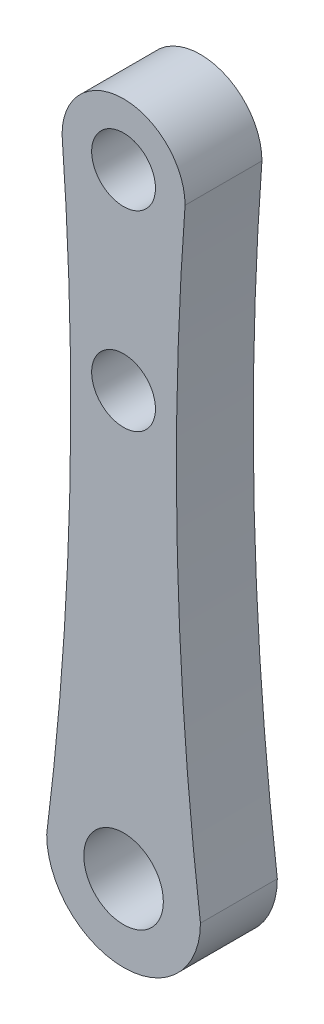
ISO-10303-21;
HEADER;
FILE_DESCRIPTION(('STEP AP214'),'2;1');
FILE_NAME('part.step','',(''),(''),'','','');
FILE_SCHEMA(('AUTOMOTIVE_DESIGN { 1 0 10303 214 1 1 1 1 }'));
ENDSEC;
DATA;
#1=APPLICATION_CONTEXT('core data for automotive mechanical design processes');
#2=APPLICATION_PROTOCOL_DEFINITION('international standard','automotive_design',2000,#1);
#3=PRODUCT_CONTEXT('',#1,'mechanical');
#4=PRODUCT('Part','Part','',(#3));
#5=PRODUCT_RELATED_PRODUCT_CATEGORY('part','',(#4));
#6=PRODUCT_DEFINITION_FORMATION('','',#4);
#7=PRODUCT_DEFINITION_CONTEXT('part definition',#1,'design');
#8=PRODUCT_DEFINITION('design','',#6,#7);
#9=PRODUCT_DEFINITION_SHAPE('','',#8);
#10=(LENGTH_UNIT() NAMED_UNIT(*) SI_UNIT(.MILLI.,.METRE.));
#11=(NAMED_UNIT(*) PLANE_ANGLE_UNIT() SI_UNIT($,.RADIAN.));
#12=(NAMED_UNIT(*) SI_UNIT($,.STERADIAN.) SOLID_ANGLE_UNIT());
#13=UNCERTAINTY_MEASURE_WITH_UNIT(LENGTH_MEASURE(1.E-05),#10,'distance_accuracy_value','');
#14=(GEOMETRIC_REPRESENTATION_CONTEXT(3) GLOBAL_UNCERTAINTY_ASSIGNED_CONTEXT((#13)) GLOBAL_UNIT_ASSIGNED_CONTEXT((#10,
#11,#12)) REPRESENTATION_CONTEXT('',''));
#15=CARTESIAN_POINT('',(0.,0.,0.));
#16=DIRECTION('',(0.,0.,1.));
#17=DIRECTION('',(1.,0.,0.));
#18=AXIS2_PLACEMENT_3D('',#15,#16,#17);
#19=CARTESIAN_POINT('',(5.51154355847069,124.948065501126,5.));
#20=DIRECTION('',(0.,0.,-1.));
#21=DIRECTION('',(-1.,0.,0.));
#22=AXIS2_PLACEMENT_3D('',#19,#20,#21);
#23=PLANE('',#22);
#24=CARTESIAN_POINT('',(-197.858317403009,149.896131002252,5.));
#25=DIRECTION('',(0.,0.,-1.));
#26=DIRECTION('',(-1.,0.,0.));
#27=AXIS2_PLACEMENT_3D('',#24,#25,#26);
#28=CIRCLE('',#27,399.865015774699);
#29=CARTESIAN_POINT('',(200.88140451995,179.873872766802,5.));
#30=VERTEX_POINT('',#29);
#31=CARTESIAN_POINT('',(198.88140451995,100.,5.));
#32=VERTEX_POINT('',#31);
#33=EDGE_CURVE('E84',#30,#32,#28,.T.);
#34=ORIENTED_EDGE('',*,*,#33,.T.);
#35=CARTESIAN_POINT('',(208.88140451995,100.,5.));
#36=DIRECTION('',(0.,0.,1.));
#37=DIRECTION('',(1.,0.,0.));
#38=AXIS2_PLACEMENT_3D('',#35,#36,#37);
#39=CIRCLE('',#38,10.);
#40=CARTESIAN_POINT('',(218.88140451995,100.,5.));
#41=VERTEX_POINT('',#40);
#42=EDGE_CURVE('E79',#32,#41,#39,.T.);
#43=ORIENTED_EDGE('',*,*,#42,.T.);
#44=CARTESIAN_POINT('',(615.621126442908,149.896131002252,5.));
#45=DIRECTION('',(0.,0.,-1.));
#46=DIRECTION('',(1.,0.,0.));
#47=AXIS2_PLACEMENT_3D('',#44,#45,#46);
#48=CIRCLE('',#47,399.865015774698);
#49=CARTESIAN_POINT('',(216.88140451995,179.873872766802,5.));
#50=VERTEX_POINT('',#49);
#51=EDGE_CURVE('E82',#41,#50,#48,.T.);
#52=ORIENTED_EDGE('',*,*,#51,.T.);
#53=CARTESIAN_POINT('',(208.88140451995,179.873872766802,5.));
#54=DIRECTION('',(0.,0.,1.));
#55=DIRECTION('',(1.,0.,0.));
#56=AXIS2_PLACEMENT_3D('',#53,#54,#55);
#57=CIRCLE('',#56,8.00000000000001);
#58=EDGE_CURVE('E49',#50,#30,#57,.T.);
#59=ORIENTED_EDGE('',*,*,#58,.T.);
#60=EDGE_LOOP('',(#34,#43,#52,#59));
#61=FACE_BOUND('',#60,.T.);
#62=CARTESIAN_POINT('',(208.88140451995,155.,5.));
#63=DIRECTION('',(0.,0.,1.));
#64=DIRECTION('',(1.,0.,0.));
#65=AXIS2_PLACEMENT_3D('',#62,#63,#64);
#66=CIRCLE('',#65,4.14999999999998);
#67=CARTESIAN_POINT('',(213.03140451995,155.,5.));
#68=VERTEX_POINT('',#67);
#69=EDGE_CURVE('E99',#68,#68,#66,.T.);
#70=ORIENTED_EDGE('',*,*,#69,.F.);
#71=EDGE_LOOP('',(#70));
#72=FACE_BOUND('',#71,.T.);
#73=CARTESIAN_POINT('',(208.88140451995,179.873872766802,5.));
#74=DIRECTION('',(0.,0.,1.));
#75=DIRECTION('',(1.,0.,0.));
#76=AXIS2_PLACEMENT_3D('',#73,#74,#75);
#77=CIRCLE('',#76,4.14999999999998);
#78=CARTESIAN_POINT('',(213.03140451995,179.873872766802,5.));
#79=VERTEX_POINT('',#78);
#80=EDGE_CURVE('E114',#79,#79,#77,.T.);
#81=ORIENTED_EDGE('',*,*,#80,.F.);
#82=EDGE_LOOP('',(#81));
#83=FACE_BOUND('',#82,.T.);
#84=CARTESIAN_POINT('',(208.88140451995,100.,5.));
#85=DIRECTION('',(0.,0.,1.));
#86=DIRECTION('',(1.,0.,0.));
#87=AXIS2_PLACEMENT_3D('',#84,#85,#86);
#88=CIRCLE('',#87,5.17500000000002);
#89=CARTESIAN_POINT('',(214.05640451995,100.,5.));
#90=VERTEX_POINT('',#89);
#91=EDGE_CURVE('E120',#90,#90,#88,.T.);
#92=ORIENTED_EDGE('',*,*,#91,.F.);
#93=EDGE_LOOP('',(#92));
#94=FACE_BOUND('',#93,.T.);
#95=ADVANCED_FACE('F32',(#61,#72,#83,#94),#23,.F.);
#96=CARTESIAN_POINT('',(5.51154355847069,124.948065501126,-5.));
#97=DIRECTION('',(0.,0.,-1.));
#98=DIRECTION('',(-1.,0.,0.));
#99=AXIS2_PLACEMENT_3D('',#96,#97,#98);
#100=PLANE('',#99);
#101=CARTESIAN_POINT('',(208.88140451995,179.873872766802,-5.));
#102=DIRECTION('',(0.,0.,1.));
#103=DIRECTION('',(1.,0.,0.));
#104=AXIS2_PLACEMENT_3D('',#101,#102,#103);
#105=CIRCLE('',#104,4.14999999999998);
#106=CARTESIAN_POINT('',(213.03140451995,179.873872766802,-5.));
#107=VERTEX_POINT('',#106);
#108=EDGE_CURVE('E117',#107,#107,#105,.T.);
#109=ORIENTED_EDGE('',*,*,#108,.T.);
#110=EDGE_LOOP('',(#109));
#111=FACE_BOUND('',#110,.T.);
#112=CARTESIAN_POINT('',(-197.858317403009,149.896131002252,-5.));
#113=DIRECTION('',(0.,0.,-1.));
#114=DIRECTION('',(-1.,0.,0.));
#115=AXIS2_PLACEMENT_3D('',#112,#113,#114);
#116=CIRCLE('',#115,399.865015774699);
#117=CARTESIAN_POINT('',(200.88140451995,179.873872766802,-5.));
#118=VERTEX_POINT('',#117);
#119=CARTESIAN_POINT('',(198.88140451995,100.,-5.));
#120=VERTEX_POINT('',#119);
#121=EDGE_CURVE('E96',#118,#120,#116,.T.);
#122=ORIENTED_EDGE('',*,*,#121,.F.);
#123=CARTESIAN_POINT('',(208.88140451995,179.873872766802,-5.));
#124=DIRECTION('',(0.,0.,1.));
#125=DIRECTION('',(1.,0.,0.));
#126=AXIS2_PLACEMENT_3D('',#123,#124,#125);
#127=CIRCLE('',#126,8.00000000000001);
#128=CARTESIAN_POINT('',(216.88140451995,179.873872766802,-5.));
#129=VERTEX_POINT('',#128);
#130=EDGE_CURVE('E72',#129,#118,#127,.T.);
#131=ORIENTED_EDGE('',*,*,#130,.F.);
#132=CARTESIAN_POINT('',(615.621126442908,149.896131002252,-5.));
#133=DIRECTION('',(0.,0.,-1.));
#134=DIRECTION('',(1.,0.,0.));
#135=AXIS2_PLACEMENT_3D('',#132,#133,#134);
#136=CIRCLE('',#135,399.865015774698);
#137=CARTESIAN_POINT('',(218.88140451995,100.,-5.));
#138=VERTEX_POINT('',#137);
#139=EDGE_CURVE('E66',#138,#129,#136,.T.);
#140=ORIENTED_EDGE('',*,*,#139,.F.);
#141=CARTESIAN_POINT('',(208.88140451995,100.,-5.));
#142=DIRECTION('',(0.,0.,1.));
#143=DIRECTION('',(1.,0.,0.));
#144=AXIS2_PLACEMENT_3D('',#141,#142,#143);
#145=CIRCLE('',#144,10.);
#146=EDGE_CURVE('E88',#120,#138,#145,.T.);
#147=ORIENTED_EDGE('',*,*,#146,.F.);
#148=EDGE_LOOP('',(#122,#131,#140,#147));
#149=FACE_BOUND('',#148,.T.);
#150=CARTESIAN_POINT('',(208.88140451995,155.,-5.));
#151=DIRECTION('',(0.,0.,1.));
#152=DIRECTION('',(1.,0.,0.));
#153=AXIS2_PLACEMENT_3D('',#150,#151,#152);
#154=CIRCLE('',#153,4.14999999999998);
#155=CARTESIAN_POINT('',(213.03140451995,155.,-5.));
#156=VERTEX_POINT('',#155);
#157=EDGE_CURVE('E111',#156,#156,#154,.T.);
#158=ORIENTED_EDGE('',*,*,#157,.T.);
#159=EDGE_LOOP('',(#158));
#160=FACE_BOUND('',#159,.T.);
#161=CARTESIAN_POINT('',(208.88140451995,100.,-5.));
#162=DIRECTION('',(0.,0.,1.));
#163=DIRECTION('',(1.,0.,0.));
#164=AXIS2_PLACEMENT_3D('',#161,#162,#163);
#165=CIRCLE('',#164,5.17500000000002);
#166=CARTESIAN_POINT('',(214.05640451995,100.,-5.));
#167=VERTEX_POINT('',#166);
#168=EDGE_CURVE('E123',#167,#167,#165,.T.);
#169=ORIENTED_EDGE('',*,*,#168,.T.);
#170=EDGE_LOOP('',(#169));
#171=FACE_BOUND('',#170,.T.);
#172=ADVANCED_FACE('F107',(#111,#149,#160,#171),#100,.T.);
#173=CARTESIAN_POINT('',(-197.858317403009,149.896131002252,5.));
#174=DIRECTION('',(0.,0.,-1.));
#175=DIRECTION('',(-1.,0.,0.));
#176=AXIS2_PLACEMENT_3D('',#173,#174,#175);
#177=CYLINDRICAL_SURFACE('',#176,399.865015774699);
#178=ORIENTED_EDGE('',*,*,#121,.T.);
#179=DIRECTION('',(0.,0.,-1.));
#180=VECTOR('',#179,1.);
#181=CARTESIAN_POINT('',(198.88140451995,100.,5.));
#182=LINE('',#181,#180);
#183=EDGE_CURVE('E11',#32,#120,#182,.T.);
#184=ORIENTED_EDGE('',*,*,#183,.F.);
#185=ORIENTED_EDGE('',*,*,#33,.F.);
#186=DIRECTION('',(0.,0.,-1.));
#187=VECTOR('',#186,1.);
#188=CARTESIAN_POINT('',(200.88140451995,179.873872766802,5.));
#189=LINE('',#188,#187);
#190=EDGE_CURVE('E92',#30,#118,#189,.T.);
#191=ORIENTED_EDGE('',*,*,#190,.T.);
#192=EDGE_LOOP('',(#178,#184,#185,#191));
#193=FACE_BOUND('',#192,.T.);
#194=ADVANCED_FACE('F34',(#193),#177,.F.);
#195=CARTESIAN_POINT('',(208.88140451995,100.,5.));
#196=DIRECTION('',(0.,0.,-1.));
#197=DIRECTION('',(-1.,0.,0.));
#198=AXIS2_PLACEMENT_3D('',#195,#196,#197);
#199=CYLINDRICAL_SURFACE('',#198,10.);
#200=ORIENTED_EDGE('',*,*,#146,.T.);
#201=DIRECTION('',(0.,0.,-1.));
#202=VECTOR('',#201,1.);
#203=CARTESIAN_POINT('',(218.88140451995,100.,5.));
#204=LINE('',#203,#202);
#205=EDGE_CURVE('E41',#41,#138,#204,.T.);
#206=ORIENTED_EDGE('',*,*,#205,.F.);
#207=ORIENTED_EDGE('',*,*,#42,.F.);
#208=ORIENTED_EDGE('',*,*,#183,.T.);
#209=EDGE_LOOP('',(#200,#206,#207,#208));
#210=FACE_BOUND('',#209,.T.);
#211=ADVANCED_FACE('F87',(#210),#199,.T.);
#212=CARTESIAN_POINT('',(615.621126442908,149.896131002252,5.));
#213=DIRECTION('',(0.,0.,-1.));
#214=DIRECTION('',(-1.,0.,0.));
#215=AXIS2_PLACEMENT_3D('',#212,#213,#214);
#216=CYLINDRICAL_SURFACE('',#215,399.865015774698);
#217=ORIENTED_EDGE('',*,*,#139,.T.);
#218=DIRECTION('',(0.,0.,-1.));
#219=VECTOR('',#218,1.);
#220=CARTESIAN_POINT('',(216.88140451995,179.873872766802,5.));
#221=LINE('',#220,#219);
#222=EDGE_CURVE('E89',#50,#129,#221,.T.);
#223=ORIENTED_EDGE('',*,*,#222,.F.);
#224=ORIENTED_EDGE('',*,*,#51,.F.);
#225=ORIENTED_EDGE('',*,*,#205,.T.);
#226=EDGE_LOOP('',(#217,#223,#224,#225));
#227=FACE_BOUND('',#226,.T.);
#228=ADVANCED_FACE('F90',(#227),#216,.F.);
#229=CARTESIAN_POINT('',(208.88140451995,179.873872766802,5.));
#230=DIRECTION('',(0.,0.,-1.));
#231=DIRECTION('',(-1.,0.,0.));
#232=AXIS2_PLACEMENT_3D('',#229,#230,#231);
#233=CYLINDRICAL_SURFACE('',#232,8.00000000000001);
#234=ORIENTED_EDGE('',*,*,#130,.T.);
#235=ORIENTED_EDGE('',*,*,#190,.F.);
#236=ORIENTED_EDGE('',*,*,#58,.F.);
#237=ORIENTED_EDGE('',*,*,#222,.T.);
#238=EDGE_LOOP('',(#234,#235,#236,#237));
#239=FACE_BOUND('',#238,.T.);
#240=ADVANCED_FACE('F104',(#239),#233,.T.);
#241=CARTESIAN_POINT('',(208.88140451995,155.,5.));
#242=DIRECTION('',(0.,0.,-1.));
#243=DIRECTION('',(-1.,0.,0.));
#244=AXIS2_PLACEMENT_3D('',#241,#242,#243);
#245=CYLINDRICAL_SURFACE('',#244,4.14999999999998);
#246=ORIENTED_EDGE('',*,*,#69,.T.);
#247=EDGE_LOOP('',(#246));
#248=FACE_BOUND('',#247,.T.);
#249=ORIENTED_EDGE('',*,*,#157,.F.);
#250=EDGE_LOOP('',(#249));
#251=FACE_BOUND('',#250,.T.);
#252=ADVANCED_FACE('F140',(#248,#251),#245,.F.);
#253=CARTESIAN_POINT('',(208.88140451995,179.873872766802,5.));
#254=DIRECTION('',(0.,0.,-1.));
#255=DIRECTION('',(-1.,0.,0.));
#256=AXIS2_PLACEMENT_3D('',#253,#254,#255);
#257=CYLINDRICAL_SURFACE('',#256,4.14999999999998);
#258=ORIENTED_EDGE('',*,*,#80,.T.);
#259=EDGE_LOOP('',(#258));
#260=FACE_BOUND('',#259,.T.);
#261=ORIENTED_EDGE('',*,*,#108,.F.);
#262=EDGE_LOOP('',(#261));
#263=FACE_BOUND('',#262,.T.);
#264=ADVANCED_FACE('F186',(#260,#263),#257,.F.);
#265=CARTESIAN_POINT('',(208.88140451995,100.,5.));
#266=DIRECTION('',(0.,0.,-1.));
#267=DIRECTION('',(-1.,0.,0.));
#268=AXIS2_PLACEMENT_3D('',#265,#266,#267);
#269=CYLINDRICAL_SURFACE('',#268,5.17500000000002);
#270=ORIENTED_EDGE('',*,*,#91,.T.);
#271=EDGE_LOOP('',(#270));
#272=FACE_BOUND('',#271,.T.);
#273=ORIENTED_EDGE('',*,*,#168,.F.);
#274=EDGE_LOOP('',(#273));
#275=FACE_BOUND('',#274,.T.);
#276=ADVANCED_FACE('F129',(#272,#275),#269,.F.);
#277=CLOSED_SHELL('',(#95,#172,#194,#211,#228,#240,#252,#264,#276));
#278=MANIFOLD_SOLID_BREP('B2',#277);
#279=ADVANCED_BREP_SHAPE_REPRESENTATION('',(#18,#278),#14);
#280=SHAPE_DEFINITION_REPRESENTATION(#9,#279);
ENDSEC;
END-ISO-10303-21;
